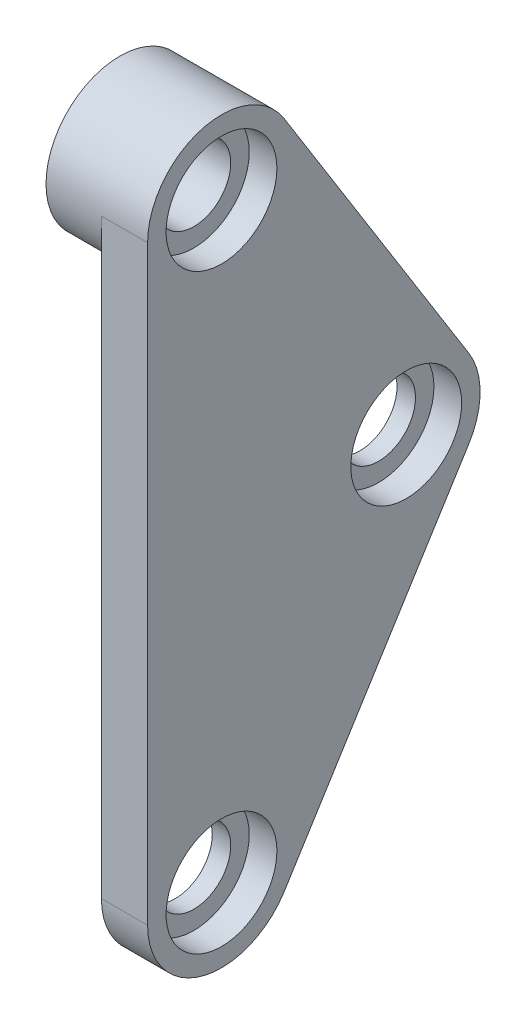
ISO-10303-21;
HEADER;
FILE_DESCRIPTION(('STEP AP214'),'2;1');
FILE_NAME('part.step','',(''),(''),'','','');
FILE_SCHEMA(('AUTOMOTIVE_DESIGN { 1 0 10303 214 1 1 1 1 }'));
ENDSEC;
DATA;
#1=APPLICATION_CONTEXT('core data for automotive mechanical design processes');
#2=APPLICATION_PROTOCOL_DEFINITION('international standard','automotive_design',2000,#1);
#3=PRODUCT_CONTEXT('',#1,'mechanical');
#4=PRODUCT('Part','Part','',(#3));
#5=PRODUCT_RELATED_PRODUCT_CATEGORY('part','',(#4));
#6=PRODUCT_DEFINITION_FORMATION('','',#4);
#7=PRODUCT_DEFINITION_CONTEXT('part definition',#1,'design');
#8=PRODUCT_DEFINITION('design','',#6,#7);
#9=PRODUCT_DEFINITION_SHAPE('','',#8);
#10=(LENGTH_UNIT() NAMED_UNIT(*) SI_UNIT(.MILLI.,.METRE.));
#11=(NAMED_UNIT(*) PLANE_ANGLE_UNIT() SI_UNIT($,.RADIAN.));
#12=(NAMED_UNIT(*) SI_UNIT($,.STERADIAN.) SOLID_ANGLE_UNIT());
#13=UNCERTAINTY_MEASURE_WITH_UNIT(LENGTH_MEASURE(1.E-05),#10,'distance_accuracy_value','');
#14=(GEOMETRIC_REPRESENTATION_CONTEXT(3) GLOBAL_UNCERTAINTY_ASSIGNED_CONTEXT((#13)) GLOBAL_UNIT_ASSIGNED_CONTEXT((#10,
#11,#12)) REPRESENTATION_CONTEXT('',''));
#15=CARTESIAN_POINT('',(0.,0.,0.));
#16=DIRECTION('',(0.,0.,1.));
#17=DIRECTION('',(1.,0.,0.));
#18=AXIS2_PLACEMENT_3D('',#15,#16,#17);
#19=CARTESIAN_POINT('',(2.5,-4.,-4.));
#20=DIRECTION('',(-1.,0.,0.));
#21=DIRECTION('',(0.,0.,1.));
#22=AXIS2_PLACEMENT_3D('',#19,#20,#21);
#23=CYLINDRICAL_SURFACE('',#22,2.);
#24=CARTESIAN_POINT('',(-3.,-4.,-4.));
#25=DIRECTION('',(1.,0.,0.));
#26=DIRECTION('',(0.,0.,-1.));
#27=AXIS2_PLACEMENT_3D('',#24,#25,#26);
#28=CIRCLE('',#27,2.);
#29=CARTESIAN_POINT('',(-3.,-4.,-6.));
#30=VERTEX_POINT('',#29);
#31=EDGE_CURVE('E241',#30,#30,#28,.T.);
#32=ORIENTED_EDGE('',*,*,#31,.F.);
#33=EDGE_LOOP('',(#32));
#34=FACE_BOUND('',#33,.T.);
#35=CARTESIAN_POINT('',(1.,-4.,-4.));
#36=DIRECTION('',(1.,0.,0.));
#37=DIRECTION('',(0.,0.,-1.));
#38=AXIS2_PLACEMENT_3D('',#35,#36,#37);
#39=CIRCLE('',#38,2.);
#40=CARTESIAN_POINT('',(1.,-4.,-6.));
#41=VERTEX_POINT('',#40);
#42=EDGE_CURVE('E269',#41,#41,#39,.F.);
#43=ORIENTED_EDGE('',*,*,#42,.F.);
#44=EDGE_LOOP('',(#43));
#45=FACE_BOUND('',#44,.T.);
#46=ADVANCED_FACE('F104',(#34,#45),#23,.F.);
#47=CARTESIAN_POINT('',(2.5,-36.,-4.));
#48=DIRECTION('',(-1.,0.,0.));
#49=DIRECTION('',(0.,0.,1.));
#50=AXIS2_PLACEMENT_3D('',#47,#48,#49);
#51=CYLINDRICAL_SURFACE('',#50,2.);
#52=CARTESIAN_POINT('',(0.,-36.,-4.));
#53=DIRECTION('',(1.,0.,0.));
#54=DIRECTION('',(0.,0.,-1.));
#55=AXIS2_PLACEMENT_3D('',#52,#53,#54);
#56=CIRCLE('',#55,2.);
#57=CARTESIAN_POINT('',(0.,-36.,-6.));
#58=VERTEX_POINT('',#57);
#59=EDGE_CURVE('E235',#58,#58,#56,.F.);
#60=ORIENTED_EDGE('',*,*,#59,.T.);
#61=EDGE_LOOP('',(#60));
#62=FACE_BOUND('',#61,.T.);
#63=CARTESIAN_POINT('',(1.,-36.,-4.));
#64=DIRECTION('',(1.,0.,0.));
#65=DIRECTION('',(0.,0.,-1.));
#66=AXIS2_PLACEMENT_3D('',#63,#64,#65);
#67=CIRCLE('',#66,2.);
#68=CARTESIAN_POINT('',(1.,-36.,-6.));
#69=VERTEX_POINT('',#68);
#70=EDGE_CURVE('E254',#69,#69,#67,.F.);
#71=ORIENTED_EDGE('',*,*,#70,.F.);
#72=EDGE_LOOP('',(#71));
#73=FACE_BOUND('',#72,.T.);
#74=ADVANCED_FACE('F282',(#62,#73),#51,.F.);
#75=CARTESIAN_POINT('',(2.5,-20.,-14.));
#76=DIRECTION('',(-1.,0.,0.));
#77=DIRECTION('',(0.,0.,1.));
#78=AXIS2_PLACEMENT_3D('',#75,#76,#77);
#79=CYLINDRICAL_SURFACE('',#78,2.);
#80=CARTESIAN_POINT('',(0.,-20.,-14.));
#81=DIRECTION('',(1.,0.,0.));
#82=DIRECTION('',(0.,0.,-1.));
#83=AXIS2_PLACEMENT_3D('',#80,#81,#82);
#84=CIRCLE('',#83,2.);
#85=CARTESIAN_POINT('',(0.,-20.,-16.));
#86=VERTEX_POINT('',#85);
#87=EDGE_CURVE('E229',#86,#86,#84,.F.);
#88=ORIENTED_EDGE('',*,*,#87,.T.);
#89=EDGE_LOOP('',(#88));
#90=FACE_BOUND('',#89,.T.);
#91=CARTESIAN_POINT('',(1.,-20.,-14.));
#92=DIRECTION('',(1.,0.,0.));
#93=DIRECTION('',(0.,0.,-1.));
#94=AXIS2_PLACEMENT_3D('',#91,#92,#93);
#95=CIRCLE('',#94,2.);
#96=CARTESIAN_POINT('',(1.,-20.,-16.));
#97=VERTEX_POINT('',#96);
#98=EDGE_CURVE('E108',#97,#97,#95,.T.);
#99=ORIENTED_EDGE('',*,*,#98,.T.);
#100=EDGE_LOOP('',(#99));
#101=FACE_BOUND('',#100,.T.);
#102=ADVANCED_FACE('F288',(#90,#101),#79,.F.);
#103=CARTESIAN_POINT('',(2.5,2.79415306338351,-4.47064490141361));
#104=DIRECTION('',(0.,0.52999894000318,-0.847998304005088));
#105=DIRECTION('',(0.,0.847998304005088,0.52999894000318));
#106=AXIS2_PLACEMENT_3D('',#103,#104,#105);
#107=PLANE('',#106);
#108=DIRECTION('',(0.,-0.847998304005088,-0.52999894000318));
#109=VECTOR('',#108,1.);
#110=CARTESIAN_POINT('',(0.,2.79415306338351,-4.47064490141361));
#111=LINE('',#110,#109);
#112=CARTESIAN_POINT('',(0.,-1.88000423998728,-7.39199321602035));
#113=VERTEX_POINT('',#112);
#114=CARTESIAN_POINT('',(0.,-17.8800042399873,-17.3919932160204));
#115=VERTEX_POINT('',#114);
#116=EDGE_CURVE('E198',#113,#115,#111,.T.);
#117=ORIENTED_EDGE('',*,*,#116,.F.);
#118=DIRECTION('',(-1.,0.,0.));
#119=VECTOR('',#118,1.);
#120=CARTESIAN_POINT('',(2.5,-1.88000423998728,-7.39199321602035));
#121=LINE('',#120,#119);
#122=CARTESIAN_POINT('',(2.5,-1.88000423998728,-7.39199321602035));
#123=VERTEX_POINT('',#122);
#124=EDGE_CURVE('E213',#123,#113,#121,.T.);
#125=ORIENTED_EDGE('',*,*,#124,.F.);
#126=DIRECTION('',(0.,-0.847998304005088,-0.52999894000318));
#127=VECTOR('',#126,1.);
#128=CARTESIAN_POINT('',(2.5,2.79415306338351,-4.47064490141361));
#129=LINE('',#128,#127);
#130=CARTESIAN_POINT('',(2.5,-17.8800042399873,-17.3919932160204));
#131=VERTEX_POINT('',#130);
#132=EDGE_CURVE('E189',#123,#131,#129,.T.);
#133=ORIENTED_EDGE('',*,*,#132,.T.);
#134=DIRECTION('',(-1.,0.,0.));
#135=VECTOR('',#134,1.);
#136=CARTESIAN_POINT('',(2.5,-17.8800042399873,-17.3919932160204));
#137=LINE('',#136,#135);
#138=EDGE_CURVE('E115',#131,#115,#137,.T.);
#139=ORIENTED_EDGE('',*,*,#138,.T.);
#140=EDGE_LOOP('',(#117,#125,#133,#139));
#141=FACE_BOUND('',#140,.T.);
#142=ADVANCED_FACE('F297',(#141),#107,.T.);
#143=CARTESIAN_POINT('',(2.5,0.,0.));
#144=DIRECTION('',(0.,0.,-1.));
#145=DIRECTION('',(-1.,0.,0.));
#146=AXIS2_PLACEMENT_3D('',#143,#144,#145);
#147=PLANE('',#146);
#148=DIRECTION('',(0.,-1.,0.));
#149=VECTOR('',#148,1.);
#150=CARTESIAN_POINT('',(0.,0.,0.));
#151=LINE('',#150,#149);
#152=CARTESIAN_POINT('',(0.,-4.,0.));
#153=VERTEX_POINT('',#152);
#154=CARTESIAN_POINT('',(0.,-36.,0.));
#155=VERTEX_POINT('',#154);
#156=EDGE_CURVE('E168',#153,#155,#151,.T.);
#157=ORIENTED_EDGE('',*,*,#156,.T.);
#158=DIRECTION('',(-1.,0.,0.));
#159=VECTOR('',#158,1.);
#160=CARTESIAN_POINT('',(2.5,-36.,0.));
#161=LINE('',#160,#159);
#162=CARTESIAN_POINT('',(2.5,-36.,0.));
#163=VERTEX_POINT('',#162);
#164=EDGE_CURVE('E161',#163,#155,#161,.T.);
#165=ORIENTED_EDGE('',*,*,#164,.F.);
#166=DIRECTION('',(0.,-1.,0.));
#167=VECTOR('',#166,1.);
#168=CARTESIAN_POINT('',(2.5,0.,0.));
#169=LINE('',#168,#167);
#170=CARTESIAN_POINT('',(2.5,-4.,0.));
#171=VERTEX_POINT('',#170);
#172=EDGE_CURVE('E166',#171,#163,#169,.T.);
#173=ORIENTED_EDGE('',*,*,#172,.F.);
#174=DIRECTION('',(-1.,0.,0.));
#175=VECTOR('',#174,1.);
#176=CARTESIAN_POINT('',(2.5,-4.,0.));
#177=LINE('',#176,#175);
#178=EDGE_CURVE('E172',#171,#153,#177,.T.);
#179=ORIENTED_EDGE('',*,*,#178,.T.);
#180=EDGE_LOOP('',(#157,#165,#173,#179));
#181=FACE_BOUND('',#180,.T.);
#182=ADVANCED_FACE('F163',(#181),#147,.F.);
#183=CARTESIAN_POINT('',(2.5,-14.0301081195633,-22.4481729913013));
#184=DIRECTION('',(0.,-0.52999894000318,-0.847998304005088));
#185=DIRECTION('',(0.,0.847998304005088,-0.52999894000318));
#186=AXIS2_PLACEMENT_3D('',#183,#184,#185);
#187=PLANE('',#186);
#188=DIRECTION('',(0.,-0.847998304005088,0.52999894000318));
#189=VECTOR('',#188,1.);
#190=CARTESIAN_POINT('',(0.,-14.0301081195633,-22.4481729913013));
#191=LINE('',#190,#189);
#192=CARTESIAN_POINT('',(0.,-22.1199957600127,-17.3919932160204));
#193=VERTEX_POINT('',#192);
#194=CARTESIAN_POINT('',(0.,-38.1199957600127,-7.39199321602035));
#195=VERTEX_POINT('',#194);
#196=EDGE_CURVE('E195',#193,#195,#191,.T.);
#197=ORIENTED_EDGE('',*,*,#196,.F.);
#198=DIRECTION('',(-1.,0.,0.));
#199=VECTOR('',#198,1.);
#200=CARTESIAN_POINT('',(2.5,-22.1199957600127,-17.3919932160204));
#201=LINE('',#200,#199);
#202=CARTESIAN_POINT('',(2.5,-22.1199957600127,-17.3919932160204));
#203=VERTEX_POINT('',#202);
#204=EDGE_CURVE('E124',#203,#193,#201,.T.);
#205=ORIENTED_EDGE('',*,*,#204,.F.);
#206=DIRECTION('',(0.,-0.847998304005088,0.52999894000318));
#207=VECTOR('',#206,1.);
#208=CARTESIAN_POINT('',(2.5,-14.0301081195633,-22.4481729913013));
#209=LINE('',#208,#207);
#210=CARTESIAN_POINT('',(2.5,-38.1199957600127,-7.39199321602035));
#211=VERTEX_POINT('',#210);
#212=EDGE_CURVE('E188',#203,#211,#209,.T.);
#213=ORIENTED_EDGE('',*,*,#212,.T.);
#214=DIRECTION('',(-1.,0.,0.));
#215=VECTOR('',#214,1.);
#216=CARTESIAN_POINT('',(2.5,-38.1199957600127,-7.39199321602035));
#217=LINE('',#216,#215);
#218=EDGE_CURVE('E141',#211,#195,#217,.T.);
#219=ORIENTED_EDGE('',*,*,#218,.T.);
#220=EDGE_LOOP('',(#197,#205,#213,#219));
#221=FACE_BOUND('',#220,.T.);
#222=ADVANCED_FACE('F312',(#221),#187,.T.);
#223=CARTESIAN_POINT('',(0.,0.,0.));
#224=DIRECTION('',(1.,0.,0.));
#225=DIRECTION('',(0.,0.,-1.));
#226=AXIS2_PLACEMENT_3D('',#223,#224,#225);
#227=PLANE('',#226);
#228=ORIENTED_EDGE('',*,*,#87,.F.);
#229=EDGE_LOOP('',(#228));
#230=FACE_BOUND('',#229,.T.);
#231=ORIENTED_EDGE('',*,*,#59,.F.);
#232=EDGE_LOOP('',(#231));
#233=FACE_BOUND('',#232,.T.);
#234=ORIENTED_EDGE('',*,*,#156,.F.);
#235=CARTESIAN_POINT('',(0.,-4.,-4.));
#236=DIRECTION('',(1.,0.,0.));
#237=DIRECTION('',(0.,0.,-1.));
#238=AXIS2_PLACEMENT_3D('',#235,#236,#237);
#239=CIRCLE('',#238,4.);
#240=EDGE_CURVE('E12',#153,#113,#239,.T.);
#241=ORIENTED_EDGE('',*,*,#240,.T.);
#242=ORIENTED_EDGE('',*,*,#116,.T.);
#243=CARTESIAN_POINT('',(0.,-20.,-14.));
#244=DIRECTION('',(1.,0.,0.));
#245=DIRECTION('',(0.,0.,-1.));
#246=AXIS2_PLACEMENT_3D('',#243,#244,#245);
#247=CIRCLE('',#246,4.);
#248=EDGE_CURVE('E179',#193,#115,#247,.T.);
#249=ORIENTED_EDGE('',*,*,#248,.F.);
#250=ORIENTED_EDGE('',*,*,#196,.T.);
#251=CARTESIAN_POINT('',(0.,-36.,-4.));
#252=DIRECTION('',(1.,0.,0.));
#253=DIRECTION('',(0.,0.,-1.));
#254=AXIS2_PLACEMENT_3D('',#251,#252,#253);
#255=CIRCLE('',#254,4.);
#256=EDGE_CURVE('E180',#155,#195,#255,.T.);
#257=ORIENTED_EDGE('',*,*,#256,.F.);
#258=EDGE_LOOP('',(#234,#241,#242,#249,#250,#257));
#259=FACE_BOUND('',#258,.T.);
#260=ADVANCED_FACE('F308',(#230,#233,#259),#227,.F.);
#261=CARTESIAN_POINT('',(2.5,0.,0.));
#262=DIRECTION('',(1.,0.,0.));
#263=DIRECTION('',(0.,0.,-1.));
#264=AXIS2_PLACEMENT_3D('',#261,#262,#263);
#265=PLANE('',#264);
#266=CARTESIAN_POINT('',(2.5,-4.,-4.));
#267=DIRECTION('',(1.,0.,0.));
#268=DIRECTION('',(0.,0.,-1.));
#269=AXIS2_PLACEMENT_3D('',#266,#267,#268);
#270=CIRCLE('',#269,3.);
#271=CARTESIAN_POINT('',(2.5,-4.,-7.));
#272=VERTEX_POINT('',#271);
#273=EDGE_CURVE('E265',#272,#272,#270,.T.);
#274=ORIENTED_EDGE('',*,*,#273,.F.);
#275=EDGE_LOOP('',(#274));
#276=FACE_BOUND('',#275,.T.);
#277=CARTESIAN_POINT('',(2.5,-36.,-4.));
#278=DIRECTION('',(1.,0.,0.));
#279=DIRECTION('',(0.,0.,-1.));
#280=AXIS2_PLACEMENT_3D('',#277,#278,#279);
#281=CIRCLE('',#280,3.);
#282=CARTESIAN_POINT('',(2.5,-36.,-7.));
#283=VERTEX_POINT('',#282);
#284=EDGE_CURVE('E258',#283,#283,#281,.T.);
#285=ORIENTED_EDGE('',*,*,#284,.F.);
#286=EDGE_LOOP('',(#285));
#287=FACE_BOUND('',#286,.T.);
#288=CARTESIAN_POINT('',(2.5,-20.,-14.));
#289=DIRECTION('',(1.,0.,0.));
#290=DIRECTION('',(0.,0.,-1.));
#291=AXIS2_PLACEMENT_3D('',#288,#289,#290);
#292=CIRCLE('',#291,3.);
#293=CARTESIAN_POINT('',(2.5,-20.,-17.));
#294=VERTEX_POINT('',#293);
#295=EDGE_CURVE('E249',#294,#294,#292,.T.);
#296=ORIENTED_EDGE('',*,*,#295,.F.);
#297=EDGE_LOOP('',(#296));
#298=FACE_BOUND('',#297,.T.);
#299=ORIENTED_EDGE('',*,*,#212,.F.);
#300=CARTESIAN_POINT('',(2.5,-20.,-14.));
#301=DIRECTION('',(1.,0.,0.));
#302=DIRECTION('',(0.,0.,-1.));
#303=AXIS2_PLACEMENT_3D('',#300,#301,#302);
#304=CIRCLE('',#303,4.);
#305=EDGE_CURVE('E221',#203,#131,#304,.T.);
#306=ORIENTED_EDGE('',*,*,#305,.T.);
#307=ORIENTED_EDGE('',*,*,#132,.F.);
#308=CARTESIAN_POINT('',(2.5,-4.,-4.));
#309=DIRECTION('',(1.,0.,0.));
#310=DIRECTION('',(0.,0.,-1.));
#311=AXIS2_PLACEMENT_3D('',#308,#309,#310);
#312=CIRCLE('',#311,4.);
#313=EDGE_CURVE('E186',#123,#171,#312,.T.);
#314=ORIENTED_EDGE('',*,*,#313,.T.);
#315=ORIENTED_EDGE('',*,*,#172,.T.);
#316=CARTESIAN_POINT('',(2.5,-36.,-4.));
#317=DIRECTION('',(1.,0.,0.));
#318=DIRECTION('',(0.,0.,-1.));
#319=AXIS2_PLACEMENT_3D('',#316,#317,#318);
#320=CIRCLE('',#319,4.);
#321=EDGE_CURVE('E175',#163,#211,#320,.T.);
#322=ORIENTED_EDGE('',*,*,#321,.T.);
#323=EDGE_LOOP('',(#299,#306,#307,#314,#315,#322));
#324=FACE_BOUND('',#323,.T.);
#325=ADVANCED_FACE('F183',(#276,#287,#298,#324),#265,.T.);
#326=CARTESIAN_POINT('',(2.5,-36.,-4.));
#327=DIRECTION('',(-1.,0.,0.));
#328=DIRECTION('',(0.,0.,1.));
#329=AXIS2_PLACEMENT_3D('',#326,#327,#328);
#330=CYLINDRICAL_SURFACE('',#329,4.);
#331=ORIENTED_EDGE('',*,*,#321,.F.);
#332=ORIENTED_EDGE('',*,*,#164,.T.);
#333=ORIENTED_EDGE('',*,*,#256,.T.);
#334=ORIENTED_EDGE('',*,*,#218,.F.);
#335=EDGE_LOOP('',(#331,#332,#333,#334));
#336=FACE_BOUND('',#335,.T.);
#337=ADVANCED_FACE('F106',(#336),#330,.T.);
#338=CARTESIAN_POINT('',(2.5,-20.,-14.));
#339=DIRECTION('',(-1.,0.,0.));
#340=DIRECTION('',(0.,0.,1.));
#341=AXIS2_PLACEMENT_3D('',#338,#339,#340);
#342=CYLINDRICAL_SURFACE('',#341,4.);
#343=ORIENTED_EDGE('',*,*,#248,.T.);
#344=ORIENTED_EDGE('',*,*,#138,.F.);
#345=ORIENTED_EDGE('',*,*,#305,.F.);
#346=ORIENTED_EDGE('',*,*,#204,.T.);
#347=EDGE_LOOP('',(#343,#344,#345,#346));
#348=FACE_BOUND('',#347,.T.);
#349=ADVANCED_FACE('F322',(#348),#342,.T.);
#350=CARTESIAN_POINT('',(2.5,-4.,-4.));
#351=DIRECTION('',(-1.,0.,0.));
#352=DIRECTION('',(0.,0.,1.));
#353=AXIS2_PLACEMENT_3D('',#350,#351,#352);
#354=CYLINDRICAL_SURFACE('',#353,4.);
#355=ORIENTED_EDGE('',*,*,#313,.F.);
#356=ORIENTED_EDGE('',*,*,#124,.T.);
#357=ORIENTED_EDGE('',*,*,#240,.F.);
#358=ORIENTED_EDGE('',*,*,#178,.F.);
#359=EDGE_LOOP('',(#355,#356,#357,#358));
#360=FACE_BOUND('',#359,.T.);
#361=CARTESIAN_POINT('',(-3.,-4.,-4.));
#362=DIRECTION('',(1.,0.,0.));
#363=DIRECTION('',(0.,0.,-1.));
#364=AXIS2_PLACEMENT_3D('',#361,#362,#363);
#365=CIRCLE('',#364,4.);
#366=CARTESIAN_POINT('',(-3.,-4.,-8.));
#367=VERTEX_POINT('',#366);
#368=EDGE_CURVE('E226',#367,#367,#365,.T.);
#369=ORIENTED_EDGE('',*,*,#368,.T.);
#370=EDGE_LOOP('',(#369));
#371=FACE_BOUND('',#370,.T.);
#372=ADVANCED_FACE('F304',(#360,#371),#354,.T.);
#373=CARTESIAN_POINT('',(-3.,-4.,-4.));
#374=DIRECTION('',(1.,0.,0.));
#375=DIRECTION('',(0.,0.,-1.));
#376=AXIS2_PLACEMENT_3D('',#373,#374,#375);
#377=PLANE('',#376);
#378=ORIENTED_EDGE('',*,*,#31,.T.);
#379=EDGE_LOOP('',(#378));
#380=FACE_BOUND('',#379,.T.);
#381=ORIENTED_EDGE('',*,*,#368,.F.);
#382=EDGE_LOOP('',(#381));
#383=FACE_BOUND('',#382,.T.);
#384=ADVANCED_FACE('F300',(#380,#383),#377,.F.);
#385=CARTESIAN_POINT('',(1.,-20.,-14.));
#386=DIRECTION('',(1.,0.,0.));
#387=DIRECTION('',(0.,0.,-1.));
#388=AXIS2_PLACEMENT_3D('',#385,#386,#387);
#389=CYLINDRICAL_SURFACE('',#388,3.);
#390=CARTESIAN_POINT('',(1.,-20.,-14.));
#391=DIRECTION('',(1.,0.,0.));
#392=DIRECTION('',(0.,0.,-1.));
#393=AXIS2_PLACEMENT_3D('',#390,#391,#392);
#394=CIRCLE('',#393,3.);
#395=CARTESIAN_POINT('',(1.,-20.,-17.));
#396=VERTEX_POINT('',#395);
#397=EDGE_CURVE('E245',#396,#396,#394,.T.);
#398=ORIENTED_EDGE('',*,*,#397,.F.);
#399=EDGE_LOOP('',(#398));
#400=FACE_BOUND('',#399,.T.);
#401=ORIENTED_EDGE('',*,*,#295,.T.);
#402=EDGE_LOOP('',(#401));
#403=FACE_BOUND('',#402,.T.);
#404=ADVANCED_FACE('F303',(#400,#403),#389,.F.);
#405=CARTESIAN_POINT('',(1.,-20.,-14.));
#406=DIRECTION('',(1.,0.,0.));
#407=DIRECTION('',(0.,0.,-1.));
#408=AXIS2_PLACEMENT_3D('',#405,#406,#407);
#409=PLANE('',#408);
#410=ORIENTED_EDGE('',*,*,#98,.F.);
#411=EDGE_LOOP('',(#410));
#412=FACE_BOUND('',#411,.T.);
#413=ORIENTED_EDGE('',*,*,#397,.T.);
#414=EDGE_LOOP('',(#413));
#415=FACE_BOUND('',#414,.T.);
#416=ADVANCED_FACE('F294',(#412,#415),#409,.T.);
#417=CARTESIAN_POINT('',(1.,-36.,-4.));
#418=DIRECTION('',(1.,0.,0.));
#419=DIRECTION('',(0.,0.,-1.));
#420=AXIS2_PLACEMENT_3D('',#417,#418,#419);
#421=CYLINDRICAL_SURFACE('',#420,3.);
#422=CARTESIAN_POINT('',(1.,-36.,-4.));
#423=DIRECTION('',(1.,0.,0.));
#424=DIRECTION('',(0.,0.,-1.));
#425=AXIS2_PLACEMENT_3D('',#422,#423,#424);
#426=CIRCLE('',#425,3.);
#427=CARTESIAN_POINT('',(1.,-36.,-7.));
#428=VERTEX_POINT('',#427);
#429=EDGE_CURVE('E253',#428,#428,#426,.T.);
#430=ORIENTED_EDGE('',*,*,#429,.F.);
#431=EDGE_LOOP('',(#430));
#432=FACE_BOUND('',#431,.T.);
#433=ORIENTED_EDGE('',*,*,#284,.T.);
#434=EDGE_LOOP('',(#433));
#435=FACE_BOUND('',#434,.T.);
#436=ADVANCED_FACE('F388',(#432,#435),#421,.F.);
#437=CARTESIAN_POINT('',(1.,0.,0.));
#438=DIRECTION('',(1.,0.,0.));
#439=DIRECTION('',(0.,0.,-1.));
#440=AXIS2_PLACEMENT_3D('',#437,#438,#439);
#441=PLANE('',#440);
#442=ORIENTED_EDGE('',*,*,#70,.T.);
#443=EDGE_LOOP('',(#442));
#444=FACE_BOUND('',#443,.T.);
#445=ORIENTED_EDGE('',*,*,#429,.T.);
#446=EDGE_LOOP('',(#445));
#447=FACE_BOUND('',#446,.T.);
#448=ADVANCED_FACE('F395',(#444,#447),#441,.T.);
#449=CARTESIAN_POINT('',(1.,-4.,-4.));
#450=DIRECTION('',(1.,0.,0.));
#451=DIRECTION('',(0.,0.,-1.));
#452=AXIS2_PLACEMENT_3D('',#449,#450,#451);
#453=CYLINDRICAL_SURFACE('',#452,3.);
#454=CARTESIAN_POINT('',(1.,-4.,-4.));
#455=DIRECTION('',(1.,0.,0.));
#456=DIRECTION('',(0.,0.,-1.));
#457=AXIS2_PLACEMENT_3D('',#454,#455,#456);
#458=CIRCLE('',#457,3.);
#459=CARTESIAN_POINT('',(1.,-4.,-7.));
#460=VERTEX_POINT('',#459);
#461=EDGE_CURVE('E270',#460,#460,#458,.T.);
#462=ORIENTED_EDGE('',*,*,#461,.F.);
#463=EDGE_LOOP('',(#462));
#464=FACE_BOUND('',#463,.T.);
#465=ORIENTED_EDGE('',*,*,#273,.T.);
#466=EDGE_LOOP('',(#465));
#467=FACE_BOUND('',#466,.T.);
#468=ADVANCED_FACE('F403',(#464,#467),#453,.F.);
#469=CARTESIAN_POINT('',(1.,0.,0.));
#470=DIRECTION('',(1.,0.,0.));
#471=DIRECTION('',(0.,0.,-1.));
#472=AXIS2_PLACEMENT_3D('',#469,#470,#471);
#473=PLANE('',#472);
#474=ORIENTED_EDGE('',*,*,#42,.T.);
#475=EDGE_LOOP('',(#474));
#476=FACE_BOUND('',#475,.T.);
#477=ORIENTED_EDGE('',*,*,#461,.T.);
#478=EDGE_LOOP('',(#477));
#479=FACE_BOUND('',#478,.T.);
#480=ADVANCED_FACE('F278',(#476,#479),#473,.T.);
#481=CLOSED_SHELL('',(#46,#74,#102,#142,#182,#222,#260,#325,#337,#349,#372,#384,#404,#416,#436,
#448,#468,#480));
#482=MANIFOLD_SOLID_BREP('B2',#481);
#483=ADVANCED_BREP_SHAPE_REPRESENTATION('',(#18,#482),#14);
#484=SHAPE_DEFINITION_REPRESENTATION(#9,#483);
ENDSEC;
END-ISO-10303-21;
